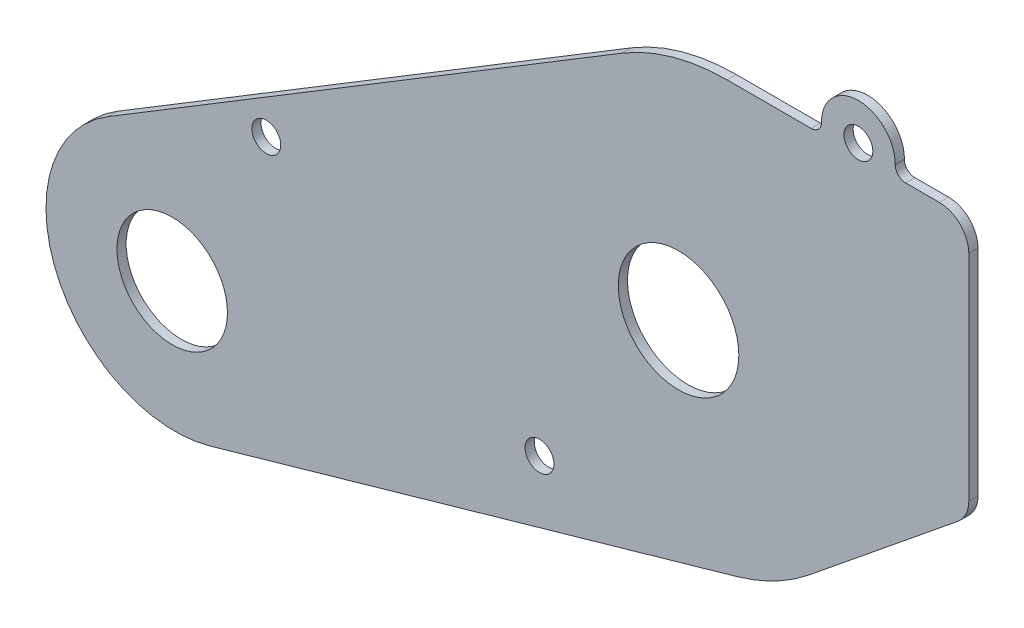
ISO-10303-21;
HEADER;
FILE_DESCRIPTION(('STEP AP214'),'2;1');
FILE_NAME('part.step','',(''),(''),'','','');
FILE_SCHEMA(('AUTOMOTIVE_DESIGN { 1 0 10303 214 1 1 1 1 }'));
ENDSEC;
DATA;
#1=APPLICATION_CONTEXT('core data for automotive mechanical design processes');
#2=APPLICATION_PROTOCOL_DEFINITION('international standard','automotive_design',2000,#1);
#3=PRODUCT_CONTEXT('',#1,'mechanical');
#4=PRODUCT('Part','Part','',(#3));
#5=PRODUCT_RELATED_PRODUCT_CATEGORY('part','',(#4));
#6=PRODUCT_DEFINITION_FORMATION('','',#4);
#7=PRODUCT_DEFINITION_CONTEXT('part definition',#1,'design');
#8=PRODUCT_DEFINITION('design','',#6,#7);
#9=PRODUCT_DEFINITION_SHAPE('','',#8);
#10=(LENGTH_UNIT() NAMED_UNIT(*) SI_UNIT(.MILLI.,.METRE.));
#11=(NAMED_UNIT(*) PLANE_ANGLE_UNIT() SI_UNIT($,.RADIAN.));
#12=(NAMED_UNIT(*) SI_UNIT($,.STERADIAN.) SOLID_ANGLE_UNIT());
#13=UNCERTAINTY_MEASURE_WITH_UNIT(LENGTH_MEASURE(1.E-05),#10,'distance_accuracy_value','');
#14=(GEOMETRIC_REPRESENTATION_CONTEXT(3) GLOBAL_UNCERTAINTY_ASSIGNED_CONTEXT((#13)) GLOBAL_UNIT_ASSIGNED_CONTEXT((#10,
#11,#12)) REPRESENTATION_CONTEXT('',''));
#15=CARTESIAN_POINT('',(0.,0.,0.));
#16=DIRECTION('',(0.,0.,1.));
#17=DIRECTION('',(1.,0.,0.));
#18=AXIS2_PLACEMENT_3D('',#15,#16,#17);
#19=CARTESIAN_POINT('',(59.9572586316337,16.1220844149742,1.5875));
#20=DIRECTION('',(0.,0.,-1.));
#21=DIRECTION('',(-1.,0.,0.));
#22=AXIS2_PLACEMENT_3D('',#19,#20,#21);
#23=PLANE('',#22);
#24=CARTESIAN_POINT('',(-56.0413692587368,-27.0192229282856,1.5875));
#25=DIRECTION('',(0.,0.,1.));
#26=DIRECTION('',(1.,0.,0.));
#27=AXIS2_PLACEMENT_3D('',#24,#25,#26);
#28=CIRCLE('',#27,2.4892);
#29=CARTESIAN_POINT('',(-53.5521692587368,-27.0192229282856,1.5875));
#30=VERTEX_POINT('',#29);
#31=EDGE_CURVE('E345',#30,#30,#28,.T.);
#32=ORIENTED_EDGE('',*,*,#31,.F.);
#33=EDGE_LOOP('',(#32));
#34=FACE_BOUND('',#33,.T.);
#35=CARTESIAN_POINT('',(-8.95127708125002,-51.0906306621206,1.5875));
#36=DIRECTION('',(0.,0.,1.));
#37=DIRECTION('',(1.,0.,0.));
#38=AXIS2_PLACEMENT_3D('',#35,#36,#37);
#39=CIRCLE('',#38,2.4892);
#40=CARTESIAN_POINT('',(-6.46207708125002,-51.0906306621206,1.5875));
#41=VERTEX_POINT('',#40);
#42=EDGE_CURVE('E347',#41,#41,#39,.T.);
#43=ORIENTED_EDGE('',*,*,#42,.F.);
#44=EDGE_LOOP('',(#43));
#45=FACE_BOUND('',#44,.T.);
#46=CARTESIAN_POINT('',(46.0070874286257,23.0853221728365,1.5875));
#47=DIRECTION('',(0.,0.,1.));
#48=DIRECTION('',(1.,0.,0.));
#49=AXIS2_PLACEMENT_3D('',#46,#47,#48);
#50=CIRCLE('',#49,2.4892);
#51=CARTESIAN_POINT('',(48.4962874286257,23.0853221728365,1.5875));
#52=VERTEX_POINT('',#51);
#53=EDGE_CURVE('E355',#52,#52,#50,.T.);
#54=ORIENTED_EDGE('',*,*,#53,.F.);
#55=EDGE_LOOP('',(#54));
#56=FACE_BOUND('',#55,.T.);
#57=CARTESIAN_POINT('',(59.9572586316337,16.1220844149742,1.5875));
#58=DIRECTION('',(0.,0.,1.));
#59=DIRECTION('',(-1.,0.,0.));
#60=AXIS2_PLACEMENT_3D('',#57,#58,#59);
#61=CIRCLE('',#60,5.08);
#62=CARTESIAN_POINT('',(65.0372586316337,16.1220844149741,1.5875));
#63=VERTEX_POINT('',#62);
#64=CARTESIAN_POINT('',(59.9572586316337,21.2020844149742,1.5875));
#65=VERTEX_POINT('',#64);
#66=EDGE_CURVE('E213',#63,#65,#61,.T.);
#67=ORIENTED_EDGE('',*,*,#66,.T.);
#68=DIRECTION('',(-1.,0.,0.));
#69=VECTOR('',#68,1.);
#70=CARTESIAN_POINT('',(54.1350874286261,21.2020844149742,1.5875));
#71=LINE('',#70,#69);
#72=CARTESIAN_POINT('',(54.1350874286261,21.2020844149742,1.5875));
#73=VERTEX_POINT('',#72);
#74=EDGE_CURVE('E121',#65,#73,#71,.T.);
#75=ORIENTED_EDGE('',*,*,#74,.T.);
#76=CARTESIAN_POINT('',(54.1350874286261,22.9800844149742,1.5875));
#77=DIRECTION('',(0.,0.,-1.));
#78=DIRECTION('',(1.,0.,0.));
#79=AXIS2_PLACEMENT_3D('',#76,#77,#78);
#80=CIRCLE('',#79,1.778);
#81=CARTESIAN_POINT('',(52.3570874286261,22.9800844149742,1.5875));
#82=VERTEX_POINT('',#81);
#83=EDGE_CURVE('E252',#73,#82,#80,.T.);
#84=ORIENTED_EDGE('',*,*,#83,.T.);
#85=DIRECTION('',(0.,1.,0.));
#86=VECTOR('',#85,1.);
#87=CARTESIAN_POINT('',(52.3570874286261,23.0853221728362,1.5875));
#88=LINE('',#87,#86);
#89=CARTESIAN_POINT('',(52.3570874286261,23.0853221728362,1.5875));
#90=VERTEX_POINT('',#89);
#91=EDGE_CURVE('E271',#82,#90,#88,.T.);
#92=ORIENTED_EDGE('',*,*,#91,.T.);
#93=CARTESIAN_POINT('',(46.0070874286257,23.0853221728365,1.5875));
#94=DIRECTION('',(0.,0.,1.));
#95=DIRECTION('',(1.,0.,0.));
#96=AXIS2_PLACEMENT_3D('',#93,#94,#95);
#97=CIRCLE('',#96,6.35000000000033);
#98=CARTESIAN_POINT('',(39.6570874286254,23.0853221728369,1.5875));
#99=VERTEX_POINT('',#98);
#100=EDGE_CURVE('E268',#90,#99,#97,.T.);
#101=ORIENTED_EDGE('',*,*,#100,.T.);
#102=DIRECTION('',(0.,-1.,0.));
#103=VECTOR('',#102,1.);
#104=CARTESIAN_POINT('',(39.6570874286254,23.0853221728369,1.5875));
#105=LINE('',#104,#103);
#106=CARTESIAN_POINT('',(39.6570874286254,22.9800844149742,1.5875));
#107=VERTEX_POINT('',#106);
#108=EDGE_CURVE('E270',#99,#107,#105,.T.);
#109=ORIENTED_EDGE('',*,*,#108,.T.);
#110=CARTESIAN_POINT('',(37.8790874286254,22.9800844149742,1.5875));
#111=DIRECTION('',(0.,0.,-1.));
#112=DIRECTION('',(-1.,0.,0.));
#113=AXIS2_PLACEMENT_3D('',#110,#111,#112);
#114=CIRCLE('',#113,1.778);
#115=CARTESIAN_POINT('',(37.8790874286254,21.2020844149742,1.5875));
#116=VERTEX_POINT('',#115);
#117=EDGE_CURVE('E273',#107,#116,#114,.T.);
#118=ORIENTED_EDGE('',*,*,#117,.T.);
#119=DIRECTION('',(-1.,0.,0.));
#120=VECTOR('',#119,1.);
#121=CARTESIAN_POINT('',(37.8790874286254,21.2020844149742,1.5875));
#122=LINE('',#121,#120);
#123=CARTESIAN_POINT('',(23.391278089272,21.2020844149742,1.5875));
#124=VERTEX_POINT('',#123);
#125=EDGE_CURVE('E279',#116,#124,#122,.T.);
#126=ORIENTED_EDGE('',*,*,#125,.T.);
#127=CARTESIAN_POINT('',(23.3912780892719,-13.7229155850258,1.5875));
#128=DIRECTION('',(0.,0.,1.));
#129=DIRECTION('',(-1.,0.,0.));
#130=AXIS2_PLACEMENT_3D('',#127,#128,#129);
#131=CIRCLE('',#130,34.925);
#132=CARTESIAN_POINT('',(5.27127097130059,16.1337581587901,1.5875));
#133=VERTEX_POINT('',#132);
#134=EDGE_CURVE('E281',#124,#133,#131,.T.);
#135=ORIENTED_EDGE('',*,*,#134,.T.);
#136=DIRECTION('',(-0.854879706336895,-0.518826259641265,0.));
#137=VECTOR('',#136,1.);
#138=CARTESIAN_POINT('',(-83.3142465666712,-37.6287681731886,1.5875));
#139=LINE('',#138,#137);
#140=CARTESIAN_POINT('',(-83.3142465666712,-37.6287681731886,1.5875));
#141=VERTEX_POINT('',#140);
#142=EDGE_CURVE('E283',#133,#141,#139,.T.);
#143=ORIENTED_EDGE('',*,*,#142,.T.);
#144=CARTESIAN_POINT('',(-71.7833329461452,-56.6284696465266,1.5875));
#145=DIRECTION('',(0.,0.,1.));
#146=DIRECTION('',(1.,0.,0.));
#147=AXIS2_PLACEMENT_3D('',#144,#145,#146);
#148=CIRCLE('',#147,22.2249999999999);
#149=CARTESIAN_POINT('',(-65.683756134902,-78.0000813715169,1.5875));
#150=VERTEX_POINT('',#149);
#151=EDGE_CURVE('E285',#141,#150,#148,.T.);
#152=ORIENTED_EDGE('',*,*,#151,.T.);
#153=DIRECTION('',(0.961602327333648,0.274446650674611,0.));
#154=VECTOR('',#153,1.);
#155=CARTESIAN_POINT('',(25.0910579064422,-52.0924447413764,1.5875));
#156=LINE('',#155,#154);
#157=CARTESIAN_POINT('',(25.0910579064422,-52.0924447413764,1.5875));
#158=VERTEX_POINT('',#157);
#159=EDGE_CURVE('E287',#150,#158,#156,.T.);
#160=ORIENTED_EDGE('',*,*,#159,.T.);
#161=CARTESIAN_POINT('',(15.5060086316314,-18.5084834592487,1.5875));
#162=DIRECTION('',(0.,0.,1.));
#163=DIRECTION('',(-1.,0.,0.));
#164=AXIS2_PLACEMENT_3D('',#161,#162,#163);
#165=CIRCLE('',#164,34.925);
#166=CARTESIAN_POINT('',(37.5194662101181,-45.6223786135818,1.5875));
#167=VERTEX_POINT('',#166);
#168=EDGE_CURVE('E164',#158,#167,#165,.T.);
#169=ORIENTED_EDGE('',*,*,#168,.T.);
#170=DIRECTION('',(0.776346317947978,0.630306587787735,0.));
#171=VECTOR('',#170,1.);
#172=CARTESIAN_POINT('',(63.1592160975954,-24.8057625110891,1.5875));
#173=LINE('',#172,#171);
#174=CARTESIAN_POINT('',(63.1592160975954,-24.8057625110891,1.5875));
#175=VERTEX_POINT('',#174);
#176=EDGE_CURVE('E158',#167,#175,#173,.T.);
#177=ORIENTED_EDGE('',*,*,#176,.T.);
#178=CARTESIAN_POINT('',(59.9572586316337,-20.8619232159134,1.5875));
#179=DIRECTION('',(0.,0.,1.));
#180=DIRECTION('',(1.,0.,0.));
#181=AXIS2_PLACEMENT_3D('',#178,#179,#180);
#182=CIRCLE('',#181,5.08);
#183=CARTESIAN_POINT('',(65.0372586316337,-20.8619232159134,1.5875));
#184=VERTEX_POINT('',#183);
#185=EDGE_CURVE('E162',#175,#184,#182,.T.);
#186=ORIENTED_EDGE('',*,*,#185,.T.);
#187=DIRECTION('',(0.,1.,0.));
#188=VECTOR('',#187,1.);
#189=CARTESIAN_POINT('',(65.0372586316337,16.1220844149741,1.5875));
#190=LINE('',#189,#188);
#191=EDGE_CURVE('E54',#184,#63,#190,.T.);
#192=ORIENTED_EDGE('',*,*,#191,.T.);
#193=EDGE_LOOP('',(#67,#75,#84,#92,#101,#109,#118,#126,#135,#143,#152,#160,#169,#177,#186,#192));
#194=FACE_BOUND('',#193,.T.);
#195=CARTESIAN_POINT('',(-72.2583329461425,-56.6284683854276,1.5875));
#196=DIRECTION('',(0.,0.,1.));
#197=DIRECTION('',(1.,0.,0.));
#198=AXIS2_PLACEMENT_3D('',#195,#196,#197);
#199=CIRCLE('',#198,9.52499999999976);
#200=CARTESIAN_POINT('',(-62.7333329461428,-56.6284683854276,1.5875));
#201=VERTEX_POINT('',#200);
#202=EDGE_CURVE('E186',#201,#201,#199,.T.);
#203=ORIENTED_EDGE('',*,*,#202,.F.);
#204=EDGE_LOOP('',(#203));
#205=FACE_BOUND('',#204,.T.);
#206=CARTESIAN_POINT('',(15.0168097118278,-18.8746196799963,1.5875));
#207=DIRECTION('',(0.,0.,1.));
#208=DIRECTION('',(1.,0.,0.));
#209=AXIS2_PLACEMENT_3D('',#206,#207,#208);
#210=CIRCLE('',#209,10.3876930189917);
#211=CARTESIAN_POINT('',(25.4045027308194,-18.8746196799963,1.5875));
#212=VERTEX_POINT('',#211);
#213=EDGE_CURVE('E362',#212,#212,#210,.T.);
#214=ORIENTED_EDGE('',*,*,#213,.F.);
#215=EDGE_LOOP('',(#214));
#216=FACE_BOUND('',#215,.T.);
#217=ADVANCED_FACE('F37',(#34,#45,#56,#194,#205,#216),#23,.F.);
#218=CARTESIAN_POINT('',(59.9572586316337,16.1220844149742,0.));
#219=DIRECTION('',(0.,0.,-1.));
#220=DIRECTION('',(-1.,0.,0.));
#221=AXIS2_PLACEMENT_3D('',#218,#219,#220);
#222=PLANE('',#221);
#223=CARTESIAN_POINT('',(-56.0413692587368,-27.0192229282856,0.));
#224=DIRECTION('',(0.,0.,1.));
#225=DIRECTION('',(1.,0.,0.));
#226=AXIS2_PLACEMENT_3D('',#223,#224,#225);
#227=CIRCLE('',#226,2.4892);
#228=CARTESIAN_POINT('',(-53.5521692587368,-27.0192229282856,0.));
#229=VERTEX_POINT('',#228);
#230=EDGE_CURVE('E343',#229,#229,#227,.T.);
#231=ORIENTED_EDGE('',*,*,#230,.T.);
#232=EDGE_LOOP('',(#231));
#233=FACE_BOUND('',#232,.T.);
#234=CARTESIAN_POINT('',(-8.95127708125002,-51.0906306621206,0.));
#235=DIRECTION('',(0.,0.,1.));
#236=DIRECTION('',(1.,0.,0.));
#237=AXIS2_PLACEMENT_3D('',#234,#235,#236);
#238=CIRCLE('',#237,2.4892);
#239=CARTESIAN_POINT('',(-6.46207708125002,-51.0906306621206,0.));
#240=VERTEX_POINT('',#239);
#241=EDGE_CURVE('E352',#240,#240,#238,.T.);
#242=ORIENTED_EDGE('',*,*,#241,.T.);
#243=EDGE_LOOP('',(#242));
#244=FACE_BOUND('',#243,.T.);
#245=CARTESIAN_POINT('',(46.0070874286257,23.0853221728365,0.));
#246=DIRECTION('',(0.,0.,1.));
#247=DIRECTION('',(1.,0.,0.));
#248=AXIS2_PLACEMENT_3D('',#245,#246,#247);
#249=CIRCLE('',#248,2.4892);
#250=CARTESIAN_POINT('',(48.4962874286257,23.0853221728365,0.));
#251=VERTEX_POINT('',#250);
#252=EDGE_CURVE('E358',#251,#251,#249,.T.);
#253=ORIENTED_EDGE('',*,*,#252,.T.);
#254=EDGE_LOOP('',(#253));
#255=FACE_BOUND('',#254,.T.);
#256=CARTESIAN_POINT('',(-72.2583329461425,-56.6284683854276,0.));
#257=DIRECTION('',(0.,0.,1.));
#258=DIRECTION('',(1.,0.,0.));
#259=AXIS2_PLACEMENT_3D('',#256,#257,#258);
#260=CIRCLE('',#259,9.52499999999976);
#261=CARTESIAN_POINT('',(-62.7333329461428,-56.6284683854276,0.));
#262=VERTEX_POINT('',#261);
#263=EDGE_CURVE('E365',#262,#262,#260,.T.);
#264=ORIENTED_EDGE('',*,*,#263,.T.);
#265=EDGE_LOOP('',(#264));
#266=FACE_BOUND('',#265,.T.);
#267=CARTESIAN_POINT('',(59.9572586316337,16.1220844149742,0.));
#268=DIRECTION('',(0.,0.,1.));
#269=DIRECTION('',(-1.,0.,0.));
#270=AXIS2_PLACEMENT_3D('',#267,#268,#269);
#271=CIRCLE('',#270,5.08);
#272=CARTESIAN_POINT('',(65.0372586316337,16.1220844149741,0.));
#273=VERTEX_POINT('',#272);
#274=CARTESIAN_POINT('',(59.9572586316337,21.2020844149742,0.));
#275=VERTEX_POINT('',#274);
#276=EDGE_CURVE('E182',#273,#275,#271,.T.);
#277=ORIENTED_EDGE('',*,*,#276,.F.);
#278=DIRECTION('',(0.,1.,0.));
#279=VECTOR('',#278,1.);
#280=CARTESIAN_POINT('',(65.0372586316337,16.1220844149741,0.));
#281=LINE('',#280,#279);
#282=CARTESIAN_POINT('',(65.0372586316337,-20.8619232159134,0.));
#283=VERTEX_POINT('',#282);
#284=EDGE_CURVE('E113',#283,#273,#281,.T.);
#285=ORIENTED_EDGE('',*,*,#284,.F.);
#286=CARTESIAN_POINT('',(59.9572586316337,-20.8619232159134,0.));
#287=DIRECTION('',(0.,0.,1.));
#288=DIRECTION('',(1.,0.,0.));
#289=AXIS2_PLACEMENT_3D('',#286,#287,#288);
#290=CIRCLE('',#289,5.08);
#291=CARTESIAN_POINT('',(63.1592160975954,-24.8057625110891,0.));
#292=VERTEX_POINT('',#291);
#293=EDGE_CURVE('E107',#292,#283,#290,.T.);
#294=ORIENTED_EDGE('',*,*,#293,.F.);
#295=DIRECTION('',(0.776346317947978,0.630306587787735,0.));
#296=VECTOR('',#295,1.);
#297=CARTESIAN_POINT('',(63.1592160975954,-24.8057625110891,0.));
#298=LINE('',#297,#296);
#299=CARTESIAN_POINT('',(37.5194662101181,-45.6223786135818,0.));
#300=VERTEX_POINT('',#299);
#301=EDGE_CURVE('E172',#300,#292,#298,.T.);
#302=ORIENTED_EDGE('',*,*,#301,.F.);
#303=CARTESIAN_POINT('',(15.5060086316314,-18.5084834592487,0.));
#304=DIRECTION('',(0.,0.,1.));
#305=DIRECTION('',(-1.,0.,0.));
#306=AXIS2_PLACEMENT_3D('',#303,#304,#305);
#307=CIRCLE('',#306,34.925);
#308=CARTESIAN_POINT('',(25.0910579064422,-52.0924447413764,0.));
#309=VERTEX_POINT('',#308);
#310=EDGE_CURVE('E208',#309,#300,#307,.T.);
#311=ORIENTED_EDGE('',*,*,#310,.F.);
#312=DIRECTION('',(0.961602327333648,0.274446650674611,0.));
#313=VECTOR('',#312,1.);
#314=CARTESIAN_POINT('',(25.0910579064422,-52.0924447413764,0.));
#315=LINE('',#314,#313);
#316=CARTESIAN_POINT('',(-65.683756134902,-78.0000813715169,0.));
#317=VERTEX_POINT('',#316);
#318=EDGE_CURVE('E206',#317,#309,#315,.T.);
#319=ORIENTED_EDGE('',*,*,#318,.F.);
#320=CARTESIAN_POINT('',(-71.7833329461452,-56.6284696465266,0.));
#321=DIRECTION('',(0.,0.,1.));
#322=DIRECTION('',(1.,0.,0.));
#323=AXIS2_PLACEMENT_3D('',#320,#321,#322);
#324=CIRCLE('',#323,22.2249999999999);
#325=CARTESIAN_POINT('',(-83.3142465666712,-37.6287681731886,0.));
#326=VERTEX_POINT('',#325);
#327=EDGE_CURVE('E204',#326,#317,#324,.T.);
#328=ORIENTED_EDGE('',*,*,#327,.F.);
#329=DIRECTION('',(-0.854879706336895,-0.518826259641265,0.));
#330=VECTOR('',#329,1.);
#331=CARTESIAN_POINT('',(-83.3142465666712,-37.6287681731886,0.));
#332=LINE('',#331,#330);
#333=CARTESIAN_POINT('',(5.27127097130059,16.1337581587901,0.));
#334=VERTEX_POINT('',#333);
#335=EDGE_CURVE('E202',#334,#326,#332,.T.);
#336=ORIENTED_EDGE('',*,*,#335,.F.);
#337=CARTESIAN_POINT('',(23.3912780892719,-13.7229155850258,0.));
#338=DIRECTION('',(0.,0.,1.));
#339=DIRECTION('',(-1.,0.,0.));
#340=AXIS2_PLACEMENT_3D('',#337,#338,#339);
#341=CIRCLE('',#340,34.925);
#342=CARTESIAN_POINT('',(23.391278089272,21.2020844149742,0.));
#343=VERTEX_POINT('',#342);
#344=EDGE_CURVE('E200',#343,#334,#341,.T.);
#345=ORIENTED_EDGE('',*,*,#344,.F.);
#346=DIRECTION('',(-1.,0.,0.));
#347=VECTOR('',#346,1.);
#348=CARTESIAN_POINT('',(37.8790874286254,21.2020844149742,0.));
#349=LINE('',#348,#347);
#350=CARTESIAN_POINT('',(37.8790874286254,21.2020844149742,0.));
#351=VERTEX_POINT('',#350);
#352=EDGE_CURVE('E198',#351,#343,#349,.T.);
#353=ORIENTED_EDGE('',*,*,#352,.F.);
#354=CARTESIAN_POINT('',(37.8790874286254,22.9800844149742,0.));
#355=DIRECTION('',(0.,0.,-1.));
#356=DIRECTION('',(-1.,0.,0.));
#357=AXIS2_PLACEMENT_3D('',#354,#355,#356);
#358=CIRCLE('',#357,1.778);
#359=CARTESIAN_POINT('',(39.6570874286254,22.9800844149742,0.));
#360=VERTEX_POINT('',#359);
#361=EDGE_CURVE('E196',#360,#351,#358,.T.);
#362=ORIENTED_EDGE('',*,*,#361,.F.);
#363=DIRECTION('',(0.,-1.,0.));
#364=VECTOR('',#363,1.);
#365=CARTESIAN_POINT('',(39.6570874286254,23.0853221728369,0.));
#366=LINE('',#365,#364);
#367=CARTESIAN_POINT('',(39.6570874286254,23.0853221728369,0.));
#368=VERTEX_POINT('',#367);
#369=EDGE_CURVE('E194',#368,#360,#366,.T.);
#370=ORIENTED_EDGE('',*,*,#369,.F.);
#371=CARTESIAN_POINT('',(46.0070874286257,23.0853221728365,0.));
#372=DIRECTION('',(0.,0.,1.));
#373=DIRECTION('',(1.,0.,0.));
#374=AXIS2_PLACEMENT_3D('',#371,#372,#373);
#375=CIRCLE('',#374,6.35000000000033);
#376=CARTESIAN_POINT('',(52.3570874286261,23.0853221728362,0.));
#377=VERTEX_POINT('',#376);
#378=EDGE_CURVE('E192',#377,#368,#375,.T.);
#379=ORIENTED_EDGE('',*,*,#378,.F.);
#380=DIRECTION('',(0.,1.,0.));
#381=VECTOR('',#380,1.);
#382=CARTESIAN_POINT('',(52.3570874286261,23.0853221728362,0.));
#383=LINE('',#382,#381);
#384=CARTESIAN_POINT('',(52.3570874286261,22.9800844149742,0.));
#385=VERTEX_POINT('',#384);
#386=EDGE_CURVE('E190',#385,#377,#383,.T.);
#387=ORIENTED_EDGE('',*,*,#386,.F.);
#388=CARTESIAN_POINT('',(54.1350874286261,22.9800844149742,0.));
#389=DIRECTION('',(0.,0.,-1.));
#390=DIRECTION('',(1.,0.,0.));
#391=AXIS2_PLACEMENT_3D('',#388,#389,#390);
#392=CIRCLE('',#391,1.778);
#393=CARTESIAN_POINT('',(54.1350874286261,21.2020844149742,0.));
#394=VERTEX_POINT('',#393);
#395=EDGE_CURVE('E188',#394,#385,#392,.T.);
#396=ORIENTED_EDGE('',*,*,#395,.F.);
#397=DIRECTION('',(-1.,0.,0.));
#398=VECTOR('',#397,1.);
#399=CARTESIAN_POINT('',(54.1350874286261,21.2020844149742,0.));
#400=LINE('',#399,#398);
#401=EDGE_CURVE('E185',#275,#394,#400,.T.);
#402=ORIENTED_EDGE('',*,*,#401,.F.);
#403=EDGE_LOOP('',(#277,#285,#294,#302,#311,#319,#328,#336,#345,#353,#362,#370,#379,#387,#396,#402));
#404=FACE_BOUND('',#403,.T.);
#405=CARTESIAN_POINT('',(15.0168097118278,-18.8746196799963,0.));
#406=DIRECTION('',(0.,0.,1.));
#407=DIRECTION('',(1.,0.,0.));
#408=AXIS2_PLACEMENT_3D('',#405,#406,#407);
#409=CIRCLE('',#408,10.3876930189917);
#410=CARTESIAN_POINT('',(25.4045027308194,-18.8746196799963,0.));
#411=VERTEX_POINT('',#410);
#412=EDGE_CURVE('E361',#411,#411,#409,.T.);
#413=ORIENTED_EDGE('',*,*,#412,.T.);
#414=EDGE_LOOP('',(#413));
#415=FACE_BOUND('',#414,.T.);
#416=ADVANCED_FACE('F256',(#233,#244,#255,#266,#404,#415),#222,.T.);
#417=CARTESIAN_POINT('',(59.9572586316337,16.1220844149742,1.5875));
#418=DIRECTION('',(0.,0.,-1.));
#419=DIRECTION('',(-1.,0.,0.));
#420=AXIS2_PLACEMENT_3D('',#417,#418,#419);
#421=CYLINDRICAL_SURFACE('',#420,5.08);
#422=ORIENTED_EDGE('',*,*,#276,.T.);
#423=DIRECTION('',(0.,0.,-1.));
#424=VECTOR('',#423,1.);
#425=CARTESIAN_POINT('',(59.9572586316337,21.2020844149742,1.5875));
#426=LINE('',#425,#424);
#427=EDGE_CURVE('E11',#65,#275,#426,.T.);
#428=ORIENTED_EDGE('',*,*,#427,.F.);
#429=ORIENTED_EDGE('',*,*,#66,.F.);
#430=DIRECTION('',(0.,0.,-1.));
#431=VECTOR('',#430,1.);
#432=CARTESIAN_POINT('',(65.0372586316337,16.1220844149741,1.5875));
#433=LINE('',#432,#431);
#434=EDGE_CURVE('E178',#63,#273,#433,.T.);
#435=ORIENTED_EDGE('',*,*,#434,.T.);
#436=EDGE_LOOP('',(#422,#428,#429,#435));
#437=FACE_BOUND('',#436,.T.);
#438=ADVANCED_FACE('F39',(#437),#421,.T.);
#439=CARTESIAN_POINT('',(54.1350874286261,21.2020844149742,1.5875));
#440=DIRECTION('',(0.,-1.,0.));
#441=DIRECTION('',(1.,0.,0.));
#442=AXIS2_PLACEMENT_3D('',#439,#440,#441);
#443=PLANE('',#442);
#444=ORIENTED_EDGE('',*,*,#401,.T.);
#445=DIRECTION('',(0.,0.,-1.));
#446=VECTOR('',#445,1.);
#447=CARTESIAN_POINT('',(54.1350874286261,21.2020844149742,1.5875));
#448=LINE('',#447,#446);
#449=EDGE_CURVE('E46',#73,#394,#448,.T.);
#450=ORIENTED_EDGE('',*,*,#449,.F.);
#451=ORIENTED_EDGE('',*,*,#74,.F.);
#452=ORIENTED_EDGE('',*,*,#427,.T.);
#453=EDGE_LOOP('',(#444,#450,#451,#452));
#454=FACE_BOUND('',#453,.T.);
#455=ADVANCED_FACE('F540',(#454),#443,.F.);
#456=CARTESIAN_POINT('',(54.1350874286261,22.9800844149742,1.5875));
#457=DIRECTION('',(0.,0.,-1.));
#458=DIRECTION('',(-1.,0.,0.));
#459=AXIS2_PLACEMENT_3D('',#456,#457,#458);
#460=CYLINDRICAL_SURFACE('',#459,1.778);
#461=ORIENTED_EDGE('',*,*,#395,.T.);
#462=DIRECTION('',(0.,0.,-1.));
#463=VECTOR('',#462,1.);
#464=CARTESIAN_POINT('',(52.3570874286261,22.9800844149742,1.5875));
#465=LINE('',#464,#463);
#466=EDGE_CURVE('E244',#82,#385,#465,.T.);
#467=ORIENTED_EDGE('',*,*,#466,.F.);
#468=ORIENTED_EDGE('',*,*,#83,.F.);
#469=ORIENTED_EDGE('',*,*,#449,.T.);
#470=EDGE_LOOP('',(#461,#467,#468,#469));
#471=FACE_BOUND('',#470,.T.);
#472=ADVANCED_FACE('F250',(#471),#460,.F.);
#473=CARTESIAN_POINT('',(52.3570874286261,23.0853221728362,1.5875));
#474=DIRECTION('',(-1.,0.,0.));
#475=DIRECTION('',(0.,0.,1.));
#476=AXIS2_PLACEMENT_3D('',#473,#474,#475);
#477=PLANE('',#476);
#478=ORIENTED_EDGE('',*,*,#386,.T.);
#479=DIRECTION('',(0.,0.,-1.));
#480=VECTOR('',#479,1.);
#481=CARTESIAN_POINT('',(52.3570874286261,23.0853221728362,1.5875));
#482=LINE('',#481,#480);
#483=EDGE_CURVE('E241',#90,#377,#482,.T.);
#484=ORIENTED_EDGE('',*,*,#483,.F.);
#485=ORIENTED_EDGE('',*,*,#91,.F.);
#486=ORIENTED_EDGE('',*,*,#466,.T.);
#487=EDGE_LOOP('',(#478,#484,#485,#486));
#488=FACE_BOUND('',#487,.T.);
#489=ADVANCED_FACE('F262',(#488),#477,.F.);
#490=CARTESIAN_POINT('',(46.0070874286257,23.0853221728365,1.5875));
#491=DIRECTION('',(0.,0.,-1.));
#492=DIRECTION('',(-1.,0.,0.));
#493=AXIS2_PLACEMENT_3D('',#490,#491,#492);
#494=CYLINDRICAL_SURFACE('',#493,6.35000000000033);
#495=ORIENTED_EDGE('',*,*,#378,.T.);
#496=DIRECTION('',(0.,0.,-1.));
#497=VECTOR('',#496,1.);
#498=CARTESIAN_POINT('',(39.6570874286254,23.0853221728369,1.5875));
#499=LINE('',#498,#497);
#500=EDGE_CURVE('E238',#99,#368,#499,.T.);
#501=ORIENTED_EDGE('',*,*,#500,.F.);
#502=ORIENTED_EDGE('',*,*,#100,.F.);
#503=ORIENTED_EDGE('',*,*,#483,.T.);
#504=EDGE_LOOP('',(#495,#501,#502,#503));
#505=FACE_BOUND('',#504,.T.);
#506=ADVANCED_FACE('F266',(#505),#494,.T.);
#507=CARTESIAN_POINT('',(39.6570874286254,23.0853221728369,1.5875));
#508=DIRECTION('',(1.,0.,0.));
#509=DIRECTION('',(0.,0.,-1.));
#510=AXIS2_PLACEMENT_3D('',#507,#508,#509);
#511=PLANE('',#510);
#512=ORIENTED_EDGE('',*,*,#369,.T.);
#513=DIRECTION('',(0.,0.,-1.));
#514=VECTOR('',#513,1.);
#515=CARTESIAN_POINT('',(39.6570874286254,22.9800844149742,1.5875));
#516=LINE('',#515,#514);
#517=EDGE_CURVE('E235',#107,#360,#516,.T.);
#518=ORIENTED_EDGE('',*,*,#517,.F.);
#519=ORIENTED_EDGE('',*,*,#108,.F.);
#520=ORIENTED_EDGE('',*,*,#500,.T.);
#521=EDGE_LOOP('',(#512,#518,#519,#520));
#522=FACE_BOUND('',#521,.T.);
#523=ADVANCED_FACE('F501',(#522),#511,.F.);
#524=CARTESIAN_POINT('',(37.8790874286254,22.9800844149742,1.5875));
#525=DIRECTION('',(0.,0.,-1.));
#526=DIRECTION('',(-1.,0.,0.));
#527=AXIS2_PLACEMENT_3D('',#524,#525,#526);
#528=CYLINDRICAL_SURFACE('',#527,1.778);
#529=ORIENTED_EDGE('',*,*,#361,.T.);
#530=DIRECTION('',(0.,0.,-1.));
#531=VECTOR('',#530,1.);
#532=CARTESIAN_POINT('',(37.8790874286254,21.2020844149742,1.5875));
#533=LINE('',#532,#531);
#534=EDGE_CURVE('E232',#116,#351,#533,.T.);
#535=ORIENTED_EDGE('',*,*,#534,.F.);
#536=ORIENTED_EDGE('',*,*,#117,.F.);
#537=ORIENTED_EDGE('',*,*,#517,.T.);
#538=EDGE_LOOP('',(#529,#535,#536,#537));
#539=FACE_BOUND('',#538,.T.);
#540=ADVANCED_FACE('F490',(#539),#528,.F.);
#541=CARTESIAN_POINT('',(37.8790874286254,21.2020844149742,1.5875));
#542=DIRECTION('',(0.,-1.,0.));
#543=DIRECTION('',(1.,0.,0.));
#544=AXIS2_PLACEMENT_3D('',#541,#542,#543);
#545=PLANE('',#544);
#546=ORIENTED_EDGE('',*,*,#352,.T.);
#547=DIRECTION('',(0.,0.,-1.));
#548=VECTOR('',#547,1.);
#549=CARTESIAN_POINT('',(23.391278089272,21.2020844149742,1.5875));
#550=LINE('',#549,#548);
#551=EDGE_CURVE('E229',#124,#343,#550,.T.);
#552=ORIENTED_EDGE('',*,*,#551,.F.);
#553=ORIENTED_EDGE('',*,*,#125,.F.);
#554=ORIENTED_EDGE('',*,*,#534,.T.);
#555=EDGE_LOOP('',(#546,#552,#553,#554));
#556=FACE_BOUND('',#555,.T.);
#557=ADVANCED_FACE('F479',(#556),#545,.F.);
#558=CARTESIAN_POINT('',(23.3912780892719,-13.7229155850258,1.5875));
#559=DIRECTION('',(0.,0.,-1.));
#560=DIRECTION('',(-1.,0.,0.));
#561=AXIS2_PLACEMENT_3D('',#558,#559,#560);
#562=CYLINDRICAL_SURFACE('',#561,34.925);
#563=ORIENTED_EDGE('',*,*,#344,.T.);
#564=DIRECTION('',(0.,0.,-1.));
#565=VECTOR('',#564,1.);
#566=CARTESIAN_POINT('',(5.27127097130059,16.1337581587901,1.5875));
#567=LINE('',#566,#565);
#568=EDGE_CURVE('E226',#133,#334,#567,.T.);
#569=ORIENTED_EDGE('',*,*,#568,.F.);
#570=ORIENTED_EDGE('',*,*,#134,.F.);
#571=ORIENTED_EDGE('',*,*,#551,.T.);
#572=EDGE_LOOP('',(#563,#569,#570,#571));
#573=FACE_BOUND('',#572,.T.);
#574=ADVANCED_FACE('F468',(#573),#562,.T.);
#575=CARTESIAN_POINT('',(-83.3142465666712,-37.6287681731886,1.5875));
#576=DIRECTION('',(0.518826259641264,-0.854879706336895,0.));
#577=DIRECTION('',(0.854879706336895,0.518826259641265,0.));
#578=AXIS2_PLACEMENT_3D('',#575,#576,#577);
#579=PLANE('',#578);
#580=ORIENTED_EDGE('',*,*,#335,.T.);
#581=DIRECTION('',(0.,0.,-1.));
#582=VECTOR('',#581,1.);
#583=CARTESIAN_POINT('',(-83.3142465666712,-37.6287681731886,1.5875));
#584=LINE('',#583,#582);
#585=EDGE_CURVE('E223',#141,#326,#584,.T.);
#586=ORIENTED_EDGE('',*,*,#585,.F.);
#587=ORIENTED_EDGE('',*,*,#142,.F.);
#588=ORIENTED_EDGE('',*,*,#568,.T.);
#589=EDGE_LOOP('',(#580,#586,#587,#588));
#590=FACE_BOUND('',#589,.T.);
#591=ADVANCED_FACE('F457',(#590),#579,.F.);
#592=CARTESIAN_POINT('',(-71.7833329461452,-56.6284696465266,1.5875));
#593=DIRECTION('',(0.,0.,-1.));
#594=DIRECTION('',(-1.,0.,0.));
#595=AXIS2_PLACEMENT_3D('',#592,#593,#594);
#596=CYLINDRICAL_SURFACE('',#595,22.2249999999999);
#597=ORIENTED_EDGE('',*,*,#327,.T.);
#598=DIRECTION('',(0.,0.,-1.));
#599=VECTOR('',#598,1.);
#600=CARTESIAN_POINT('',(-65.683756134902,-78.0000813715169,1.5875));
#601=LINE('',#600,#599);
#602=EDGE_CURVE('E220',#150,#317,#601,.T.);
#603=ORIENTED_EDGE('',*,*,#602,.F.);
#604=ORIENTED_EDGE('',*,*,#151,.F.);
#605=ORIENTED_EDGE('',*,*,#585,.T.);
#606=EDGE_LOOP('',(#597,#603,#604,#605));
#607=FACE_BOUND('',#606,.T.);
#608=ADVANCED_FACE('F447',(#607),#596,.T.);
#609=CARTESIAN_POINT('',(25.0910579064422,-52.0924447413764,1.5875));
#610=DIRECTION('',(-0.274446650674611,0.961602327333648,0.));
#611=DIRECTION('',(-0.961602327333648,-0.274446650674611,0.));
#612=AXIS2_PLACEMENT_3D('',#609,#610,#611);
#613=PLANE('',#612);
#614=ORIENTED_EDGE('',*,*,#318,.T.);
#615=DIRECTION('',(0.,0.,-1.));
#616=VECTOR('',#615,1.);
#617=CARTESIAN_POINT('',(25.0910579064422,-52.0924447413764,1.5875));
#618=LINE('',#617,#616);
#619=EDGE_CURVE('E217',#158,#309,#618,.T.);
#620=ORIENTED_EDGE('',*,*,#619,.F.);
#621=ORIENTED_EDGE('',*,*,#159,.F.);
#622=ORIENTED_EDGE('',*,*,#602,.T.);
#623=EDGE_LOOP('',(#614,#620,#621,#622));
#624=FACE_BOUND('',#623,.T.);
#625=ADVANCED_FACE('F293',(#624),#613,.F.);
#626=CARTESIAN_POINT('',(15.5060086316314,-18.5084834592487,1.5875));
#627=DIRECTION('',(0.,0.,-1.));
#628=DIRECTION('',(-1.,0.,0.));
#629=AXIS2_PLACEMENT_3D('',#626,#627,#628);
#630=CYLINDRICAL_SURFACE('',#629,34.925);
#631=ORIENTED_EDGE('',*,*,#310,.T.);
#632=DIRECTION('',(0.,0.,-1.));
#633=VECTOR('',#632,1.);
#634=CARTESIAN_POINT('',(37.5194662101181,-45.6223786135818,1.5875));
#635=LINE('',#634,#633);
#636=EDGE_CURVE('E173',#167,#300,#635,.T.);
#637=ORIENTED_EDGE('',*,*,#636,.F.);
#638=ORIENTED_EDGE('',*,*,#168,.F.);
#639=ORIENTED_EDGE('',*,*,#619,.T.);
#640=EDGE_LOOP('',(#631,#637,#638,#639));
#641=FACE_BOUND('',#640,.T.);
#642=ADVANCED_FACE('F297',(#641),#630,.T.);
#643=CARTESIAN_POINT('',(63.1592160975954,-24.8057625110891,1.5875));
#644=DIRECTION('',(-0.630306587787735,0.776346317947978,0.));
#645=DIRECTION('',(-0.776346317947978,-0.630306587787735,0.));
#646=AXIS2_PLACEMENT_3D('',#643,#644,#645);
#647=PLANE('',#646);
#648=ORIENTED_EDGE('',*,*,#301,.T.);
#649=DIRECTION('',(0.,0.,-1.));
#650=VECTOR('',#649,1.);
#651=CARTESIAN_POINT('',(63.1592160975954,-24.8057625110891,1.5875));
#652=LINE('',#651,#650);
#653=EDGE_CURVE('E169',#175,#292,#652,.T.);
#654=ORIENTED_EDGE('',*,*,#653,.F.);
#655=ORIENTED_EDGE('',*,*,#176,.F.);
#656=ORIENTED_EDGE('',*,*,#636,.T.);
#657=EDGE_LOOP('',(#648,#654,#655,#656));
#658=FACE_BOUND('',#657,.T.);
#659=ADVANCED_FACE('F170',(#658),#647,.F.);
#660=CARTESIAN_POINT('',(59.9572586316337,-20.8619232159134,1.5875));
#661=DIRECTION('',(0.,0.,-1.));
#662=DIRECTION('',(-1.,0.,0.));
#663=AXIS2_PLACEMENT_3D('',#660,#661,#662);
#664=CYLINDRICAL_SURFACE('',#663,5.08);
#665=ORIENTED_EDGE('',*,*,#293,.T.);
#666=DIRECTION('',(0.,0.,-1.));
#667=VECTOR('',#666,1.);
#668=CARTESIAN_POINT('',(65.0372586316337,-20.8619232159134,1.5875));
#669=LINE('',#668,#667);
#670=EDGE_CURVE('E174',#184,#283,#669,.T.);
#671=ORIENTED_EDGE('',*,*,#670,.F.);
#672=ORIENTED_EDGE('',*,*,#185,.F.);
#673=ORIENTED_EDGE('',*,*,#653,.T.);
#674=EDGE_LOOP('',(#665,#671,#672,#673));
#675=FACE_BOUND('',#674,.T.);
#676=ADVANCED_FACE('F176',(#675),#664,.T.);
#677=CARTESIAN_POINT('',(65.0372586316337,16.1220844149741,1.5875));
#678=DIRECTION('',(-1.,0.,0.));
#679=DIRECTION('',(0.,0.,1.));
#680=AXIS2_PLACEMENT_3D('',#677,#678,#679);
#681=PLANE('',#680);
#682=ORIENTED_EDGE('',*,*,#284,.T.);
#683=ORIENTED_EDGE('',*,*,#434,.F.);
#684=ORIENTED_EDGE('',*,*,#191,.F.);
#685=ORIENTED_EDGE('',*,*,#670,.T.);
#686=EDGE_LOOP('',(#682,#683,#684,#685));
#687=FACE_BOUND('',#686,.T.);
#688=ADVANCED_FACE('F301',(#687),#681,.F.);
#689=CARTESIAN_POINT('',(-72.2583329461425,-56.6284683854276,1.5875));
#690=DIRECTION('',(0.,0.,-1.));
#691=DIRECTION('',(-1.,0.,0.));
#692=AXIS2_PLACEMENT_3D('',#689,#690,#691);
#693=CYLINDRICAL_SURFACE('',#692,9.52499999999976);
#694=ORIENTED_EDGE('',*,*,#202,.T.);
#695=EDGE_LOOP('',(#694));
#696=FACE_BOUND('',#695,.T.);
#697=ORIENTED_EDGE('',*,*,#263,.F.);
#698=EDGE_LOOP('',(#697));
#699=FACE_BOUND('',#698,.T.);
#700=ADVANCED_FACE('F303',(#696,#699),#693,.F.);
#701=CARTESIAN_POINT('',(15.0168097118278,-18.8746196799963,1.5875));
#702=DIRECTION('',(0.,0.,-1.));
#703=DIRECTION('',(-1.,0.,0.));
#704=AXIS2_PLACEMENT_3D('',#701,#702,#703);
#705=CYLINDRICAL_SURFACE('',#704,10.3876930189917);
#706=ORIENTED_EDGE('',*,*,#213,.T.);
#707=EDGE_LOOP('',(#706));
#708=FACE_BOUND('',#707,.T.);
#709=ORIENTED_EDGE('',*,*,#412,.F.);
#710=EDGE_LOOP('',(#709));
#711=FACE_BOUND('',#710,.T.);
#712=ADVANCED_FACE('F309',(#708,#711),#705,.F.);
#713=CARTESIAN_POINT('',(46.0070874286257,23.0853221728365,1.5875));
#714=DIRECTION('',(0.,0.,1.));
#715=DIRECTION('',(1.,0.,0.));
#716=AXIS2_PLACEMENT_3D('',#713,#714,#715);
#717=CYLINDRICAL_SURFACE('',#716,2.4892);
#718=ORIENTED_EDGE('',*,*,#252,.F.);
#719=EDGE_LOOP('',(#718));
#720=FACE_BOUND('',#719,.T.);
#721=ORIENTED_EDGE('',*,*,#53,.T.);
#722=EDGE_LOOP('',(#721));
#723=FACE_BOUND('',#722,.T.);
#724=ADVANCED_FACE('F326',(#720,#723),#717,.F.);
#725=CARTESIAN_POINT('',(-8.95127708125002,-51.0906306621206,1.5875));
#726=DIRECTION('',(0.,0.,1.));
#727=DIRECTION('',(1.,0.,0.));
#728=AXIS2_PLACEMENT_3D('',#725,#726,#727);
#729=CYLINDRICAL_SURFACE('',#728,2.4892);
#730=ORIENTED_EDGE('',*,*,#241,.F.);
#731=EDGE_LOOP('',(#730));
#732=FACE_BOUND('',#731,.T.);
#733=ORIENTED_EDGE('',*,*,#42,.T.);
#734=EDGE_LOOP('',(#733));
#735=FACE_BOUND('',#734,.T.);
#736=ADVANCED_FACE('F330',(#732,#735),#729,.F.);
#737=CARTESIAN_POINT('',(-56.0413692587368,-27.0192229282856,1.5875));
#738=DIRECTION('',(0.,0.,1.));
#739=DIRECTION('',(1.,0.,0.));
#740=AXIS2_PLACEMENT_3D('',#737,#738,#739);
#741=CYLINDRICAL_SURFACE('',#740,2.4892);
#742=ORIENTED_EDGE('',*,*,#230,.F.);
#743=EDGE_LOOP('',(#742));
#744=FACE_BOUND('',#743,.T.);
#745=ORIENTED_EDGE('',*,*,#31,.T.);
#746=EDGE_LOOP('',(#745));
#747=FACE_BOUND('',#746,.T.);
#748=ADVANCED_FACE('F334',(#744,#747),#741,.F.);
#749=CLOSED_SHELL('',(#217,#416,#438,#455,#472,#489,#506,#523,#540,#557,#574,#591,#608,#625,
#642,#659,#676,#688,#700,#712,#724,#736,#748));
#750=MANIFOLD_SOLID_BREP('B2',#749);
#751=ADVANCED_BREP_SHAPE_REPRESENTATION('',(#18,#750),#14);
#752=SHAPE_DEFINITION_REPRESENTATION(#9,#751);
ENDSEC;
END-ISO-10303-21;
